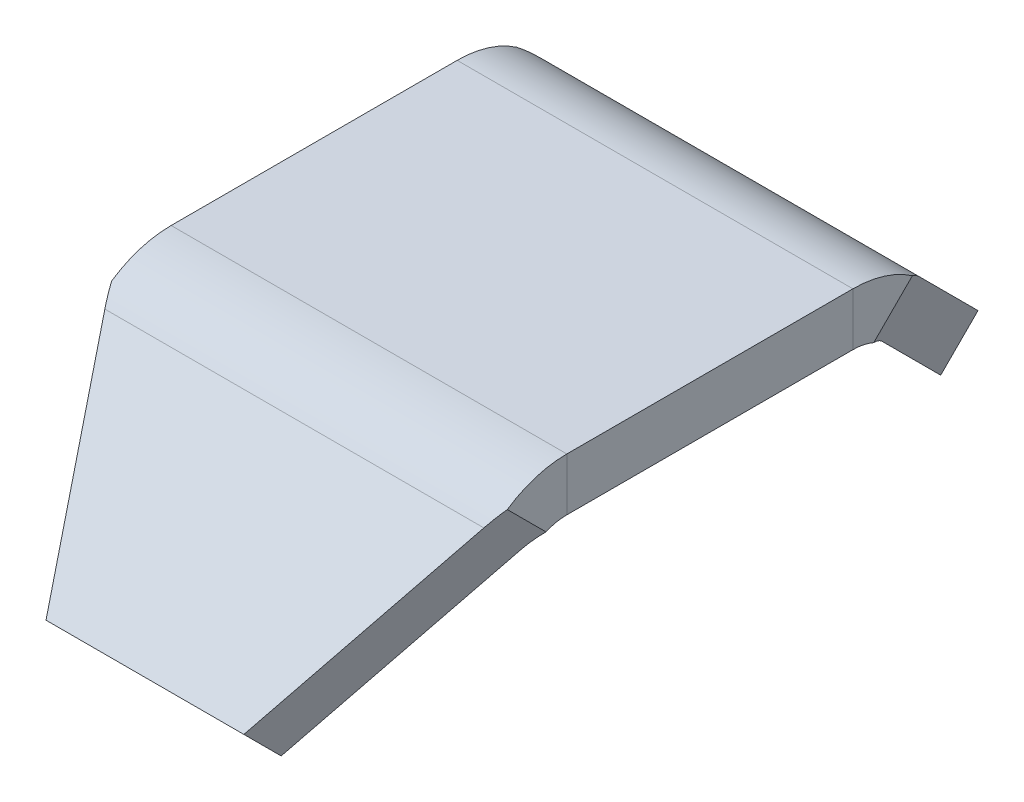
ISO-10303-21;
HEADER;
FILE_DESCRIPTION(('STEP AP214'),'2;1');
FILE_NAME('part.step','',(''),(''),'','','');
FILE_SCHEMA(('AUTOMOTIVE_DESIGN { 1 0 10303 214 1 1 1 1 }'));
ENDSEC;
DATA;
#1=APPLICATION_CONTEXT('core data for automotive mechanical design processes');
#2=APPLICATION_PROTOCOL_DEFINITION('international standard','automotive_design',2000,#1);
#3=PRODUCT_CONTEXT('',#1,'mechanical');
#4=PRODUCT('Part','Part','',(#3));
#5=PRODUCT_RELATED_PRODUCT_CATEGORY('part','',(#4));
#6=PRODUCT_DEFINITION_FORMATION('','',#4);
#7=PRODUCT_DEFINITION_CONTEXT('part definition',#1,'design');
#8=PRODUCT_DEFINITION('design','',#6,#7);
#9=PRODUCT_DEFINITION_SHAPE('','',#8);
#10=(LENGTH_UNIT() NAMED_UNIT(*) SI_UNIT(.MILLI.,.METRE.));
#11=(NAMED_UNIT(*) PLANE_ANGLE_UNIT() SI_UNIT($,.RADIAN.));
#12=(NAMED_UNIT(*) SI_UNIT($,.STERADIAN.) SOLID_ANGLE_UNIT());
#13=UNCERTAINTY_MEASURE_WITH_UNIT(LENGTH_MEASURE(1.E-05),#10,'distance_accuracy_value','');
#14=(GEOMETRIC_REPRESENTATION_CONTEXT(3) GLOBAL_UNCERTAINTY_ASSIGNED_CONTEXT((#13)) GLOBAL_UNIT_ASSIGNED_CONTEXT((#10,
#11,#12)) REPRESENTATION_CONTEXT('',''));
#15=CARTESIAN_POINT('',(0.,0.,0.));
#16=DIRECTION('',(0.,0.,1.));
#17=DIRECTION('',(1.,0.,0.));
#18=AXIS2_PLACEMENT_3D('',#15,#16,#17);
#19=CARTESIAN_POINT('',(60.,-2.34314575050759,27.3431457505076));
#20=DIRECTION('',(1.,0.,0.));
#21=DIRECTION('',(0.,0.,-1.));
#22=AXIS2_PLACEMENT_3D('',#19,#20,#21);
#23=PLANE('',#22);
#24=CARTESIAN_POINT('',(60.,-8.,21.6862915010153));
#25=DIRECTION('',(1.,0.,0.));
#26=DIRECTION('',(0.,0.,-1.));
#27=AXIS2_PLACEMENT_3D('',#24,#25,#26);
#28=CIRCLE('',#27,16.);
#29=CARTESIAN_POINT('',(60.,5.21051723159048,30.7130425485324));
#30=VERTEX_POINT('',#29);
#31=CARTESIAN_POINT('',(60.,8.,21.6862915010153));
#32=VERTEX_POINT('',#31);
#33=EDGE_CURVE('E191',#30,#32,#28,.F.);
#34=ORIENTED_EDGE('',*,*,#33,.F.);
#35=DIRECTION('',(0.,-0.707106781186551,-0.707106781186544));
#36=VECTOR('',#35,1.);
#37=CARTESIAN_POINT('',(60.,-0.251262658470964,25.251262658471));
#38=LINE('',#37,#36);
#39=CARTESIAN_POINT('',(60.,-0.652260638120036,24.8502646788219));
#40=VERTEX_POINT('',#39);
#41=EDGE_CURVE('E251',#30,#40,#38,.T.);
#42=ORIENTED_EDGE('',*,*,#41,.T.);
#43=CARTESIAN_POINT('',(60.,-8.,21.6862915010153));
#44=DIRECTION('',(1.,0.,0.));
#45=DIRECTION('',(0.,0.,-1.));
#46=AXIS2_PLACEMENT_3D('',#43,#44,#45);
#47=CIRCLE('',#46,8.);
#48=CARTESIAN_POINT('',(60.,0.,21.6862915010153));
#49=VERTEX_POINT('',#48);
#50=EDGE_CURVE('E193',#40,#49,#47,.F.);
#51=ORIENTED_EDGE('',*,*,#50,.T.);
#52=DIRECTION('',(0.,-1.,0.));
#53=VECTOR('',#52,1.);
#54=CARTESIAN_POINT('',(60.,8.,21.6862915010153));
#55=LINE('',#54,#53);
#56=EDGE_CURVE('E242',#32,#49,#55,.T.);
#57=ORIENTED_EDGE('',*,*,#56,.F.);
#58=EDGE_LOOP('',(#34,#42,#51,#57));
#59=FACE_BOUND('',#58,.T.);
#60=ADVANCED_FACE('F38',(#59),#23,.T.);
#61=CARTESIAN_POINT('',(0.,0.,21.6862915010153));
#62=DIRECTION('',(-1.,0.,0.));
#63=DIRECTION('',(0.,0.,1.));
#64=AXIS2_PLACEMENT_3D('',#61,#62,#63);
#65=PLANE('',#64);
#66=CARTESIAN_POINT('',(0.,-8.,21.6862915010153));
#67=DIRECTION('',(1.,0.,0.));
#68=DIRECTION('',(0.,0.,-1.));
#69=AXIS2_PLACEMENT_3D('',#66,#67,#68);
#70=CIRCLE('',#69,8.);
#71=CARTESIAN_POINT('',(0.,-0.652260638120032,24.8502646788219));
#72=VERTEX_POINT('',#71);
#73=CARTESIAN_POINT('',(0.,0.,21.6862915010153));
#74=VERTEX_POINT('',#73);
#75=EDGE_CURVE('E206',#72,#74,#70,.F.);
#76=ORIENTED_EDGE('',*,*,#75,.F.);
#77=DIRECTION('',(0.,0.707106781186551,0.707106781186544));
#78=VECTOR('',#77,1.);
#79=CARTESIAN_POINT('',(0.,-1.90811690796332,23.5944084089786));
#80=LINE('',#79,#78);
#81=CARTESIAN_POINT('',(0.,5.21051723159049,30.7130425485323));
#82=VERTEX_POINT('',#81);
#83=EDGE_CURVE('E269',#72,#82,#80,.T.);
#84=ORIENTED_EDGE('',*,*,#83,.T.);
#85=CARTESIAN_POINT('',(0.,-8.,21.6862915010153));
#86=DIRECTION('',(1.,0.,0.));
#87=DIRECTION('',(0.,0.,-1.));
#88=AXIS2_PLACEMENT_3D('',#85,#86,#87);
#89=CIRCLE('',#88,16.);
#90=CARTESIAN_POINT('',(0.,8.,21.6862915010153));
#91=VERTEX_POINT('',#90);
#92=EDGE_CURVE('E204',#82,#91,#89,.F.);
#93=ORIENTED_EDGE('',*,*,#92,.T.);
#94=DIRECTION('',(0.,1.,0.));
#95=VECTOR('',#94,1.);
#96=CARTESIAN_POINT('',(0.,0.,21.6862915010153));
#97=LINE('',#96,#95);
#98=EDGE_CURVE('E164',#74,#91,#97,.T.);
#99=ORIENTED_EDGE('',*,*,#98,.F.);
#100=EDGE_LOOP('',(#76,#84,#93,#99));
#101=FACE_BOUND('',#100,.T.);
#102=ADVANCED_FACE('F325',(#101),#65,.T.);
#103=CARTESIAN_POINT('',(0.,3.31370849898482,33.));
#104=DIRECTION('',(-1.,0.,0.));
#105=DIRECTION('',(0.,0.,1.));
#106=AXIS2_PLACEMENT_3D('',#103,#104,#105);
#107=PLANE('',#106);
#108=DIRECTION('',(0.,0.,-1.));
#109=VECTOR('',#108,1.);
#110=CARTESIAN_POINT('',(0.,0.,25.));
#111=LINE('',#110,#109);
#112=CARTESIAN_POINT('',(0.,0.,-21.6862915010153));
#113=VERTEX_POINT('',#112);
#114=EDGE_CURVE('E208',#74,#113,#111,.T.);
#115=ORIENTED_EDGE('',*,*,#114,.F.);
#116=ORIENTED_EDGE('',*,*,#98,.T.);
#117=DIRECTION('',(0.,0.,-1.));
#118=VECTOR('',#117,1.);
#119=CARTESIAN_POINT('',(0.,8.,25.));
#120=LINE('',#119,#118);
#121=CARTESIAN_POINT('',(0.,8.,-21.6862915010153));
#122=VERTEX_POINT('',#121);
#123=EDGE_CURVE('E202',#91,#122,#120,.T.);
#124=ORIENTED_EDGE('',*,*,#123,.T.);
#125=DIRECTION('',(0.,-1.,0.));
#126=VECTOR('',#125,1.);
#127=CARTESIAN_POINT('',(0.,8.,-21.6862915010153));
#128=LINE('',#127,#126);
#129=EDGE_CURVE('E165',#122,#113,#128,.T.);
#130=ORIENTED_EDGE('',*,*,#129,.T.);
#131=EDGE_LOOP('',(#115,#116,#124,#130));
#132=FACE_BOUND('',#131,.T.);
#133=ADVANCED_FACE('F304',(#132),#107,.T.);
#134=CARTESIAN_POINT('',(60.,0.,-21.6862915010153));
#135=DIRECTION('',(1.,0.,0.));
#136=DIRECTION('',(0.,0.,-1.));
#137=AXIS2_PLACEMENT_3D('',#134,#135,#136);
#138=PLANE('',#137);
#139=CARTESIAN_POINT('',(60.,-8.,-21.6862915010153));
#140=DIRECTION('',(1.,0.,0.));
#141=DIRECTION('',(0.,0.,-1.));
#142=AXIS2_PLACEMENT_3D('',#139,#140,#141);
#143=CIRCLE('',#142,8.);
#144=CARTESIAN_POINT('',(60.,0.,-21.6862915010153));
#145=VERTEX_POINT('',#144);
#146=CARTESIAN_POINT('',(60.,-0.652260638120024,-24.8502646788219));
#147=VERTEX_POINT('',#146);
#148=EDGE_CURVE('E198',#145,#147,#143,.F.);
#149=ORIENTED_EDGE('',*,*,#148,.T.);
#150=DIRECTION('',(0.,0.707106781186552,-0.707106781186543));
#151=VECTOR('',#150,1.);
#152=CARTESIAN_POINT('',(60.,-1.90811690796331,-23.5944084089786));
#153=LINE('',#152,#151);
#154=CARTESIAN_POINT('',(60.,5.2105172315905,-30.7130425485323));
#155=VERTEX_POINT('',#154);
#156=EDGE_CURVE('E185',#147,#155,#153,.T.);
#157=ORIENTED_EDGE('',*,*,#156,.T.);
#158=CARTESIAN_POINT('',(60.,-8.,-21.6862915010153));
#159=DIRECTION('',(1.,0.,0.));
#160=DIRECTION('',(0.,0.,-1.));
#161=AXIS2_PLACEMENT_3D('',#158,#159,#160);
#162=CIRCLE('',#161,16.);
#163=CARTESIAN_POINT('',(60.,8.,-21.6862915010153));
#164=VERTEX_POINT('',#163);
#165=EDGE_CURVE('E173',#164,#155,#162,.F.);
#166=ORIENTED_EDGE('',*,*,#165,.F.);
#167=DIRECTION('',(0.,1.,0.));
#168=VECTOR('',#167,1.);
#169=CARTESIAN_POINT('',(60.,0.,-21.6862915010153));
#170=LINE('',#169,#168);
#171=EDGE_CURVE('E152',#145,#164,#170,.T.);
#172=ORIENTED_EDGE('',*,*,#171,.F.);
#173=EDGE_LOOP('',(#149,#157,#166,#172));
#174=FACE_BOUND('',#173,.T.);
#175=ADVANCED_FACE('F183',(#174),#138,.T.);
#176=CARTESIAN_POINT('',(60.,3.31370849898482,-33.));
#177=DIRECTION('',(1.,0.,0.));
#178=DIRECTION('',(0.,0.,-1.));
#179=AXIS2_PLACEMENT_3D('',#176,#177,#178);
#180=PLANE('',#179);
#181=DIRECTION('',(0.,0.,-1.));
#182=VECTOR('',#181,1.);
#183=CARTESIAN_POINT('',(60.,0.,25.));
#184=LINE('',#183,#182);
#185=EDGE_CURVE('E159',#49,#145,#184,.T.);
#186=ORIENTED_EDGE('',*,*,#185,.T.);
#187=ORIENTED_EDGE('',*,*,#171,.T.);
#188=DIRECTION('',(0.,0.,-1.));
#189=VECTOR('',#188,1.);
#190=CARTESIAN_POINT('',(60.,8.,25.));
#191=LINE('',#190,#189);
#192=EDGE_CURVE('E157',#32,#164,#191,.T.);
#193=ORIENTED_EDGE('',*,*,#192,.F.);
#194=ORIENTED_EDGE('',*,*,#56,.T.);
#195=EDGE_LOOP('',(#186,#187,#193,#194));
#196=FACE_BOUND('',#195,.T.);
#197=ADVANCED_FACE('F154',(#196),#180,.T.);
#198=CARTESIAN_POINT('',(0.,-2.34314575050759,-27.3431457505076));
#199=DIRECTION('',(-1.,0.,0.));
#200=DIRECTION('',(0.,0.,1.));
#201=AXIS2_PLACEMENT_3D('',#198,#199,#200);
#202=PLANE('',#201);
#203=CARTESIAN_POINT('',(0.,-8.,-21.6862915010153));
#204=DIRECTION('',(1.,0.,0.));
#205=DIRECTION('',(0.,0.,-1.));
#206=AXIS2_PLACEMENT_3D('',#203,#204,#205);
#207=CIRCLE('',#206,16.);
#208=CARTESIAN_POINT('',(0.,5.2105172315905,-30.7130425485323));
#209=VERTEX_POINT('',#208);
#210=EDGE_CURVE('E176',#122,#209,#207,.F.);
#211=ORIENTED_EDGE('',*,*,#210,.T.);
#212=DIRECTION('',(0.,-0.707106781186552,0.707106781186543));
#213=VECTOR('',#212,1.);
#214=CARTESIAN_POINT('',(0.,-0.251262658470952,-25.251262658471));
#215=LINE('',#214,#213);
#216=CARTESIAN_POINT('',(0.,-0.652260638120024,-24.8502646788219));
#217=VERTEX_POINT('',#216);
#218=EDGE_CURVE('E282',#209,#217,#215,.T.);
#219=ORIENTED_EDGE('',*,*,#218,.T.);
#220=CARTESIAN_POINT('',(0.,-8.,-21.6862915010153));
#221=DIRECTION('',(1.,0.,0.));
#222=DIRECTION('',(0.,0.,-1.));
#223=AXIS2_PLACEMENT_3D('',#220,#221,#222);
#224=CIRCLE('',#223,8.);
#225=EDGE_CURVE('E186',#113,#217,#224,.F.);
#226=ORIENTED_EDGE('',*,*,#225,.F.);
#227=ORIENTED_EDGE('',*,*,#129,.F.);
#228=EDGE_LOOP('',(#211,#219,#226,#227));
#229=FACE_BOUND('',#228,.T.);
#230=ADVANCED_FACE('F300',(#229),#202,.T.);
#231=CARTESIAN_POINT('',(60.,0.,-25.));
#232=DIRECTION('',(0.,0.707106781186551,-0.707106781186544));
#233=DIRECTION('',(0.,0.707106781186544,0.707106781186551));
#234=AXIS2_PLACEMENT_3D('',#231,#232,#233);
#235=PLANE('',#234);
#236=DIRECTION('',(-1.,0.,0.));
#237=VECTOR('',#236,1.);
#238=CARTESIAN_POINT('',(60.,-2.34314575050759,-27.3431457505076));
#239=LINE('',#238,#237);
#240=CARTESIAN_POINT('',(58.7321273830041,-2.34314575050759,-27.3431457505076));
#241=VERTEX_POINT('',#240);
#242=CARTESIAN_POINT('',(1.26787261699594,-2.34314575050759,-27.3431457505076));
#243=VERTEX_POINT('',#242);
#244=EDGE_CURVE('E200',#241,#243,#239,.T.);
#245=ORIENTED_EDGE('',*,*,#244,.T.);
#246=DIRECTION('',(-0.393919298579168,0.649933683619678,0.649933683619685));
#247=VECTOR('',#246,1.);
#248=CARTESIAN_POINT('',(0.,-0.25126265847095,-25.251262658471));
#249=LINE('',#248,#247);
#250=CARTESIAN_POINT('',(15.,-25.,-50.0000000000003));
#251=VERTEX_POINT('',#250);
#252=EDGE_CURVE('E287',#243,#251,#249,.F.);
#253=ORIENTED_EDGE('',*,*,#252,.T.);
#254=DIRECTION('',(-1.,0.,0.));
#255=VECTOR('',#254,1.);
#256=CARTESIAN_POINT('',(60.,-25.,-50.0000000000003));
#257=LINE('',#256,#255);
#258=CARTESIAN_POINT('',(45.,-25.,-50.0000000000003));
#259=VERTEX_POINT('',#258);
#260=EDGE_CURVE('E237',#259,#251,#257,.T.);
#261=ORIENTED_EDGE('',*,*,#260,.F.);
#262=DIRECTION('',(-0.393919298579168,-0.649933683619678,-0.649933683619685));
#263=VECTOR('',#262,1.);
#264=CARTESIAN_POINT('',(45.,-25.,-50.0000000000003));
#265=LINE('',#264,#263);
#266=EDGE_CURVE('E260',#259,#241,#265,.F.);
#267=ORIENTED_EDGE('',*,*,#266,.T.);
#268=EDGE_LOOP('',(#245,#253,#261,#267));
#269=FACE_BOUND('',#268,.T.);
#270=ADVANCED_FACE('F292',(#269),#235,.F.);
#271=CARTESIAN_POINT('',(60.,-19.3431457505076,-55.6568542494926));
#272=DIRECTION('',(0.,-0.707106781186543,-0.707106781186552));
#273=DIRECTION('',(0.,0.707106781186552,-0.707106781186543));
#274=AXIS2_PLACEMENT_3D('',#271,#272,#273);
#275=PLANE('',#274);
#276=ORIENTED_EDGE('',*,*,#260,.T.);
#277=DIRECTION('',(0.,0.707106781186552,-0.707106781186543));
#278=VECTOR('',#277,1.);
#279=CARTESIAN_POINT('',(15.,-19.3431457505076,-55.6568542494926));
#280=LINE('',#279,#278);
#281=CARTESIAN_POINT('',(15.,-19.3431457505076,-55.6568542494926));
#282=VERTEX_POINT('',#281);
#283=EDGE_CURVE('E60',#251,#282,#280,.T.);
#284=ORIENTED_EDGE('',*,*,#283,.T.);
#285=DIRECTION('',(-1.,0.,0.));
#286=VECTOR('',#285,1.);
#287=CARTESIAN_POINT('',(60.,-19.3431457505076,-55.6568542494926));
#288=LINE('',#287,#286);
#289=CARTESIAN_POINT('',(45.,-19.3431457505076,-55.6568542494926));
#290=VERTEX_POINT('',#289);
#291=EDGE_CURVE('E235',#290,#282,#288,.T.);
#292=ORIENTED_EDGE('',*,*,#291,.F.);
#293=DIRECTION('',(0.,-0.707106781186552,0.707106781186543));
#294=VECTOR('',#293,1.);
#295=CARTESIAN_POINT('',(45.,-19.3431457505076,-55.6568542494926));
#296=LINE('',#295,#294);
#297=EDGE_CURVE('E257',#290,#259,#296,.T.);
#298=ORIENTED_EDGE('',*,*,#297,.T.);
#299=EDGE_LOOP('',(#276,#284,#292,#298));
#300=FACE_BOUND('',#299,.T.);
#301=ADVANCED_FACE('F295',(#300),#275,.T.);
#302=CARTESIAN_POINT('',(60.,5.65685424949242,-30.6568542494924));
#303=DIRECTION('',(0.,0.707106781186551,-0.707106781186544));
#304=DIRECTION('',(0.,0.707106781186544,0.707106781186551));
#305=AXIS2_PLACEMENT_3D('',#302,#303,#304);
#306=PLANE('',#305);
#307=ORIENTED_EDGE('',*,*,#291,.T.);
#308=DIRECTION('',(0.393919298579168,-0.649933683619678,-0.649933683619685));
#309=VECTOR('',#308,1.);
#310=CARTESIAN_POINT('',(9.18168758196761,-9.74342003018488,-46.0571285291698));
#311=LINE('',#310,#309);
#312=CARTESIAN_POINT('',(1.26787261699594,3.31370849898482,-33.));
#313=VERTEX_POINT('',#312);
#314=EDGE_CURVE('E46',#282,#313,#311,.F.);
#315=ORIENTED_EDGE('',*,*,#314,.T.);
#316=DIRECTION('',(-1.,0.,0.));
#317=VECTOR('',#316,1.);
#318=CARTESIAN_POINT('',(60.,3.31370849898482,-33.));
#319=LINE('',#318,#317);
#320=CARTESIAN_POINT('',(58.7321273830041,3.31370849898482,-33.));
#321=VERTEX_POINT('',#320);
#322=EDGE_CURVE('E180',#321,#313,#319,.T.);
#323=ORIENTED_EDGE('',*,*,#322,.F.);
#324=DIRECTION('',(0.393919298579168,0.649933683619678,0.649933683619685));
#325=VECTOR('',#324,1.);
#326=CARTESIAN_POINT('',(60.1286572456186,5.61786521628141,-30.6958432827034));
#327=LINE('',#326,#325);
#328=EDGE_CURVE('E267',#321,#290,#327,.F.);
#329=ORIENTED_EDGE('',*,*,#328,.T.);
#330=EDGE_LOOP('',(#307,#315,#323,#329));
#331=FACE_BOUND('',#330,.T.);
#332=ADVANCED_FACE('F315',(#331),#306,.T.);
#333=CARTESIAN_POINT('',(60.,-8.,-21.6862915010153));
#334=DIRECTION('',(-1.,0.,0.));
#335=DIRECTION('',(0.,0.,1.));
#336=AXIS2_PLACEMENT_3D('',#333,#334,#335);
#337=CYLINDRICAL_SURFACE('',#336,16.);
#338=ORIENTED_EDGE('',*,*,#322,.T.);
#339=CARTESIAN_POINT('',(1.26787261699594,-8.,-21.6862915010153));
#340=DIRECTION('',(0.919145030018058,0.278543007265576,0.278543007265579));
#341=DIRECTION('',(-0.393919298579167,0.649933683619678,0.649933683619686));
#342=AXIS2_PLACEMENT_3D('',#339,#340,#341);
#343=ELLIPSE('',#342,17.4074813848318,16.);
#344=EDGE_CURVE('E11',#313,#209,#343,.T.);
#345=ORIENTED_EDGE('',*,*,#344,.T.);
#346=ORIENTED_EDGE('',*,*,#210,.F.);
#347=DIRECTION('',(-1.,0.,0.));
#348=VECTOR('',#347,1.);
#349=CARTESIAN_POINT('',(60.,8.,-21.6862915010153));
#350=LINE('',#349,#348);
#351=EDGE_CURVE('E171',#164,#122,#350,.T.);
#352=ORIENTED_EDGE('',*,*,#351,.F.);
#353=ORIENTED_EDGE('',*,*,#165,.T.);
#354=CARTESIAN_POINT('',(58.7321273830041,-8.,-21.6862915010153));
#355=DIRECTION('',(-0.919145030018058,0.278543007265576,0.278543007265579));
#356=DIRECTION('',(-0.393919298579167,-0.649933683619678,-0.649933683619686));
#357=AXIS2_PLACEMENT_3D('',#354,#355,#356);
#358=ELLIPSE('',#357,17.4074813848318,16.);
#359=EDGE_CURVE('E265',#155,#321,#358,.T.);
#360=ORIENTED_EDGE('',*,*,#359,.T.);
#361=EDGE_LOOP('',(#338,#345,#346,#352,#353,#360));
#362=FACE_BOUND('',#361,.T.);
#363=ADVANCED_FACE('F172',(#362),#337,.T.);
#364=CARTESIAN_POINT('',(60.,8.,25.));
#365=DIRECTION('',(0.,1.,0.));
#366=DIRECTION('',(0.,0.,1.));
#367=AXIS2_PLACEMENT_3D('',#364,#365,#366);
#368=PLANE('',#367);
#369=ORIENTED_EDGE('',*,*,#123,.F.);
#370=DIRECTION('',(-1.,0.,0.));
#371=VECTOR('',#370,1.);
#372=CARTESIAN_POINT('',(60.,8.,21.6862915010153));
#373=LINE('',#372,#371);
#374=EDGE_CURVE('E181',#32,#91,#373,.T.);
#375=ORIENTED_EDGE('',*,*,#374,.F.);
#376=ORIENTED_EDGE('',*,*,#192,.T.);
#377=ORIENTED_EDGE('',*,*,#351,.T.);
#378=EDGE_LOOP('',(#369,#375,#376,#377));
#379=FACE_BOUND('',#378,.T.);
#380=ADVANCED_FACE('F189',(#379),#368,.T.);
#381=CARTESIAN_POINT('',(60.,-8.,21.6862915010153));
#382=DIRECTION('',(-1.,0.,0.));
#383=DIRECTION('',(0.,0.,1.));
#384=AXIS2_PLACEMENT_3D('',#381,#382,#383);
#385=CYLINDRICAL_SURFACE('',#384,16.);
#386=ORIENTED_EDGE('',*,*,#92,.F.);
#387=CARTESIAN_POINT('',(1.26787261699594,-8.,21.6862915010153));
#388=DIRECTION('',(0.919145030018058,0.278543007265576,-0.278543007265579));
#389=DIRECTION('',(-0.393919298579168,0.649933683619678,-0.649933683619685));
#390=AXIS2_PLACEMENT_3D('',#387,#388,#389);
#391=ELLIPSE('',#390,17.4074813848318,16.);
#392=CARTESIAN_POINT('',(1.26787261699594,3.31370849898482,33.));
#393=VERTEX_POINT('',#392);
#394=EDGE_CURVE('E272',#82,#393,#391,.T.);
#395=ORIENTED_EDGE('',*,*,#394,.T.);
#396=DIRECTION('',(-1.,0.,0.));
#397=VECTOR('',#396,1.);
#398=CARTESIAN_POINT('',(60.,3.31370849898482,33.));
#399=LINE('',#398,#397);
#400=CARTESIAN_POINT('',(58.7321273830041,3.31370849898482,33.));
#401=VERTEX_POINT('',#400);
#402=EDGE_CURVE('E230',#401,#393,#399,.T.);
#403=ORIENTED_EDGE('',*,*,#402,.F.);
#404=CARTESIAN_POINT('',(58.7321273830041,-8.,21.6862915010153));
#405=DIRECTION('',(-0.919145030018058,0.278543007265576,-0.278543007265579));
#406=DIRECTION('',(-0.393919298579168,-0.649933683619678,0.649933683619685));
#407=AXIS2_PLACEMENT_3D('',#404,#405,#406);
#408=ELLIPSE('',#407,17.4074813848318,16.);
#409=EDGE_CURVE('E249',#401,#30,#408,.T.);
#410=ORIENTED_EDGE('',*,*,#409,.T.);
#411=ORIENTED_EDGE('',*,*,#33,.T.);
#412=ORIENTED_EDGE('',*,*,#374,.T.);
#413=EDGE_LOOP('',(#386,#395,#403,#410,#411,#412));
#414=FACE_BOUND('',#413,.T.);
#415=ADVANCED_FACE('F374',(#414),#385,.T.);
#416=CARTESIAN_POINT('',(60.,5.65685424949241,30.6568542494924));
#417=DIRECTION('',(0.,0.707106781186551,0.707106781186544));
#418=DIRECTION('',(0.,-0.707106781186544,0.707106781186551));
#419=AXIS2_PLACEMENT_3D('',#416,#417,#418);
#420=PLANE('',#419);
#421=ORIENTED_EDGE('',*,*,#402,.T.);
#422=DIRECTION('',(-0.393919298579168,0.649933683619678,-0.649933683619685));
#423=VECTOR('',#422,1.);
#424=CARTESIAN_POINT('',(9.18168758196761,-9.74342003018489,46.0571285291698));
#425=LINE('',#424,#423);
#426=CARTESIAN_POINT('',(15.,-19.3431457505076,55.6568542494926));
#427=VERTEX_POINT('',#426);
#428=EDGE_CURVE('E274',#393,#427,#425,.F.);
#429=ORIENTED_EDGE('',*,*,#428,.T.);
#430=DIRECTION('',(-1.,0.,0.));
#431=VECTOR('',#430,1.);
#432=CARTESIAN_POINT('',(60.,-19.3431457505076,55.6568542494926));
#433=LINE('',#432,#431);
#434=CARTESIAN_POINT('',(45.,-19.3431457505076,55.6568542494926));
#435=VERTEX_POINT('',#434);
#436=EDGE_CURVE('E227',#435,#427,#433,.T.);
#437=ORIENTED_EDGE('',*,*,#436,.F.);
#438=DIRECTION('',(-0.393919298579168,-0.649933683619678,0.649933683619685));
#439=VECTOR('',#438,1.);
#440=CARTESIAN_POINT('',(60.1286572456186,5.6178652162814,30.6958432827034));
#441=LINE('',#440,#439);
#442=EDGE_CURVE('E247',#435,#401,#441,.F.);
#443=ORIENTED_EDGE('',*,*,#442,.T.);
#444=EDGE_LOOP('',(#421,#429,#437,#443));
#445=FACE_BOUND('',#444,.T.);
#446=ADVANCED_FACE('F369',(#445),#420,.T.);
#447=CARTESIAN_POINT('',(60.,-25.,50.0000000000003));
#448=DIRECTION('',(0.,-0.707106781186544,0.707106781186551));
#449=DIRECTION('',(0.,-0.707106781186551,-0.707106781186544));
#450=AXIS2_PLACEMENT_3D('',#447,#448,#449);
#451=PLANE('',#450);
#452=ORIENTED_EDGE('',*,*,#436,.T.);
#453=DIRECTION('',(0.,-0.707106781186551,-0.707106781186544));
#454=VECTOR('',#453,1.);
#455=CARTESIAN_POINT('',(15.,-25.,50.0000000000003));
#456=LINE('',#455,#454);
#457=CARTESIAN_POINT('',(15.,-25.,50.0000000000003));
#458=VERTEX_POINT('',#457);
#459=EDGE_CURVE('E276',#427,#458,#456,.T.);
#460=ORIENTED_EDGE('',*,*,#459,.T.);
#461=DIRECTION('',(-1.,0.,0.));
#462=VECTOR('',#461,1.);
#463=CARTESIAN_POINT('',(60.,-25.,50.0000000000003));
#464=LINE('',#463,#462);
#465=CARTESIAN_POINT('',(45.,-25.,50.0000000000003));
#466=VERTEX_POINT('',#465);
#467=EDGE_CURVE('E224',#466,#458,#464,.T.);
#468=ORIENTED_EDGE('',*,*,#467,.F.);
#469=DIRECTION('',(0.,0.707106781186551,0.707106781186544));
#470=VECTOR('',#469,1.);
#471=CARTESIAN_POINT('',(45.,-25.,50.0000000000003));
#472=LINE('',#471,#470);
#473=EDGE_CURVE('E244',#466,#435,#472,.T.);
#474=ORIENTED_EDGE('',*,*,#473,.T.);
#475=EDGE_LOOP('',(#452,#460,#468,#474));
#476=FACE_BOUND('',#475,.T.);
#477=ADVANCED_FACE('F366',(#476),#451,.T.);
#478=CARTESIAN_POINT('',(60.,0.,25.));
#479=DIRECTION('',(0.,0.707106781186551,0.707106781186544));
#480=DIRECTION('',(0.,-0.707106781186544,0.707106781186551));
#481=AXIS2_PLACEMENT_3D('',#478,#479,#480);
#482=PLANE('',#481);
#483=ORIENTED_EDGE('',*,*,#467,.T.);
#484=DIRECTION('',(0.393919298579168,-0.649933683619678,0.649933683619685));
#485=VECTOR('',#484,1.);
#486=CARTESIAN_POINT('',(0.,-0.251262658470955,25.251262658471));
#487=LINE('',#486,#485);
#488=CARTESIAN_POINT('',(1.26787261699594,-2.34314575050759,27.3431457505076));
#489=VERTEX_POINT('',#488);
#490=EDGE_CURVE('E278',#458,#489,#487,.F.);
#491=ORIENTED_EDGE('',*,*,#490,.T.);
#492=DIRECTION('',(-1.,0.,0.));
#493=VECTOR('',#492,1.);
#494=CARTESIAN_POINT('',(60.,-2.34314575050759,27.3431457505076));
#495=LINE('',#494,#493);
#496=CARTESIAN_POINT('',(58.7321273830041,-2.34314575050759,27.3431457505076));
#497=VERTEX_POINT('',#496);
#498=EDGE_CURVE('E221',#497,#489,#495,.T.);
#499=ORIENTED_EDGE('',*,*,#498,.F.);
#500=DIRECTION('',(0.393919298579168,0.649933683619678,-0.649933683619685));
#501=VECTOR('',#500,1.);
#502=CARTESIAN_POINT('',(45.,-25.,50.0000000000003));
#503=LINE('',#502,#501);
#504=EDGE_CURVE('E255',#497,#466,#503,.F.);
#505=ORIENTED_EDGE('',*,*,#504,.T.);
#506=EDGE_LOOP('',(#483,#491,#499,#505));
#507=FACE_BOUND('',#506,.T.);
#508=ADVANCED_FACE('F354',(#507),#482,.F.);
#509=CARTESIAN_POINT('',(60.,-8.,21.6862915010153));
#510=DIRECTION('',(-1.,0.,0.));
#511=DIRECTION('',(0.,0.,1.));
#512=AXIS2_PLACEMENT_3D('',#509,#510,#511);
#513=CYLINDRICAL_SURFACE('',#512,8.);
#514=ORIENTED_EDGE('',*,*,#498,.T.);
#515=CARTESIAN_POINT('',(1.26787261699594,-8.,21.6862915010153));
#516=DIRECTION('',(0.919145030018058,0.278543007265576,-0.278543007265579));
#517=DIRECTION('',(-0.393919298579168,0.649933683619678,-0.649933683619685));
#518=AXIS2_PLACEMENT_3D('',#515,#516,#517);
#519=ELLIPSE('',#518,8.7037406924159,8.);
#520=EDGE_CURVE('E280',#489,#72,#519,.F.);
#521=ORIENTED_EDGE('',*,*,#520,.T.);
#522=ORIENTED_EDGE('',*,*,#75,.T.);
#523=DIRECTION('',(-1.,0.,0.));
#524=VECTOR('',#523,1.);
#525=CARTESIAN_POINT('',(60.,0.,21.6862915010153));
#526=LINE('',#525,#524);
#527=EDGE_CURVE('E218',#49,#74,#526,.T.);
#528=ORIENTED_EDGE('',*,*,#527,.F.);
#529=ORIENTED_EDGE('',*,*,#50,.F.);
#530=CARTESIAN_POINT('',(58.7321273830041,-8.,21.6862915010153));
#531=DIRECTION('',(-0.919145030018058,0.278543007265576,-0.278543007265579));
#532=DIRECTION('',(-0.393919298579168,-0.649933683619678,0.649933683619685));
#533=AXIS2_PLACEMENT_3D('',#530,#531,#532);
#534=ELLIPSE('',#533,8.7037406924159,8.);
#535=EDGE_CURVE('E253',#40,#497,#534,.F.);
#536=ORIENTED_EDGE('',*,*,#535,.T.);
#537=EDGE_LOOP('',(#514,#521,#522,#528,#529,#536));
#538=FACE_BOUND('',#537,.T.);
#539=ADVANCED_FACE('F358',(#538),#513,.F.);
#540=CARTESIAN_POINT('',(60.,0.,25.));
#541=DIRECTION('',(0.,1.,0.));
#542=DIRECTION('',(0.,0.,1.));
#543=AXIS2_PLACEMENT_3D('',#540,#541,#542);
#544=PLANE('',#543);
#545=ORIENTED_EDGE('',*,*,#114,.T.);
#546=DIRECTION('',(-1.,0.,0.));
#547=VECTOR('',#546,1.);
#548=CARTESIAN_POINT('',(60.,0.,-21.6862915010153));
#549=LINE('',#548,#547);
#550=EDGE_CURVE('E215',#145,#113,#549,.T.);
#551=ORIENTED_EDGE('',*,*,#550,.F.);
#552=ORIENTED_EDGE('',*,*,#185,.F.);
#553=ORIENTED_EDGE('',*,*,#527,.T.);
#554=EDGE_LOOP('',(#545,#551,#552,#553));
#555=FACE_BOUND('',#554,.T.);
#556=ADVANCED_FACE('F306',(#555),#544,.F.);
#557=CARTESIAN_POINT('',(60.,-8.,-21.6862915010153));
#558=DIRECTION('',(-1.,0.,0.));
#559=DIRECTION('',(0.,0.,1.));
#560=AXIS2_PLACEMENT_3D('',#557,#558,#559);
#561=CYLINDRICAL_SURFACE('',#560,8.);
#562=ORIENTED_EDGE('',*,*,#225,.T.);
#563=CARTESIAN_POINT('',(1.26787261699594,-8.,-21.6862915010153));
#564=DIRECTION('',(0.919145030018058,0.278543007265576,0.278543007265579));
#565=DIRECTION('',(-0.393919298579167,0.649933683619678,0.649933683619686));
#566=AXIS2_PLACEMENT_3D('',#563,#564,#565);
#567=ELLIPSE('',#566,8.7037406924159,8.);
#568=EDGE_CURVE('E285',#217,#243,#567,.F.);
#569=ORIENTED_EDGE('',*,*,#568,.T.);
#570=ORIENTED_EDGE('',*,*,#244,.F.);
#571=CARTESIAN_POINT('',(58.7321273830041,-8.,-21.6862915010153));
#572=DIRECTION('',(-0.919145030018058,0.278543007265576,0.278543007265579));
#573=DIRECTION('',(-0.393919298579167,-0.649933683619678,-0.649933683619686));
#574=AXIS2_PLACEMENT_3D('',#571,#572,#573);
#575=ELLIPSE('',#574,8.7037406924159,8.);
#576=EDGE_CURVE('E262',#241,#147,#575,.F.);
#577=ORIENTED_EDGE('',*,*,#576,.T.);
#578=ORIENTED_EDGE('',*,*,#148,.F.);
#579=ORIENTED_EDGE('',*,*,#550,.T.);
#580=EDGE_LOOP('',(#562,#569,#570,#577,#578,#579));
#581=FACE_BOUND('',#580,.T.);
#582=ADVANCED_FACE('F310',(#581),#561,.F.);
#583=CARTESIAN_POINT('',(45.,-25.,50.0000000000003));
#584=DIRECTION('',(-0.919145030018058,0.278543007265576,-0.278543007265579));
#585=DIRECTION('',(0.,0.707106781186551,0.707106781186544));
#586=AXIS2_PLACEMENT_3D('',#583,#584,#585);
#587=PLANE('',#586);
#588=ORIENTED_EDGE('',*,*,#535,.F.);
#589=ORIENTED_EDGE('',*,*,#41,.F.);
#590=ORIENTED_EDGE('',*,*,#409,.F.);
#591=ORIENTED_EDGE('',*,*,#442,.F.);
#592=ORIENTED_EDGE('',*,*,#473,.F.);
#593=ORIENTED_EDGE('',*,*,#504,.F.);
#594=EDGE_LOOP('',(#588,#589,#590,#591,#592,#593));
#595=FACE_BOUND('',#594,.T.);
#596=ADVANCED_FACE('F336',(#595),#587,.F.);
#597=CARTESIAN_POINT('',(45.,-19.3431457505076,-55.6568542494926));
#598=DIRECTION('',(-0.919145030018058,0.278543007265576,0.278543007265579));
#599=DIRECTION('',(0.,-0.707106781186552,0.707106781186543));
#600=AXIS2_PLACEMENT_3D('',#597,#598,#599);
#601=PLANE('',#600);
#602=ORIENTED_EDGE('',*,*,#359,.F.);
#603=ORIENTED_EDGE('',*,*,#156,.F.);
#604=ORIENTED_EDGE('',*,*,#576,.F.);
#605=ORIENTED_EDGE('',*,*,#266,.F.);
#606=ORIENTED_EDGE('',*,*,#297,.F.);
#607=ORIENTED_EDGE('',*,*,#328,.F.);
#608=EDGE_LOOP('',(#602,#603,#604,#605,#606,#607));
#609=FACE_BOUND('',#608,.T.);
#610=ADVANCED_FACE('F313',(#609),#601,.F.);
#611=CARTESIAN_POINT('',(0.,-1.90811690796333,23.5944084089786));
#612=DIRECTION('',(0.919145030018058,0.278543007265576,-0.278543007265579));
#613=DIRECTION('',(0.,0.707106781186551,0.707106781186544));
#614=AXIS2_PLACEMENT_3D('',#611,#612,#613);
#615=PLANE('',#614);
#616=ORIENTED_EDGE('',*,*,#490,.F.);
#617=ORIENTED_EDGE('',*,*,#459,.F.);
#618=ORIENTED_EDGE('',*,*,#428,.F.);
#619=ORIENTED_EDGE('',*,*,#394,.F.);
#620=ORIENTED_EDGE('',*,*,#83,.F.);
#621=ORIENTED_EDGE('',*,*,#520,.F.);
#622=EDGE_LOOP('',(#616,#617,#618,#619,#620,#621));
#623=FACE_BOUND('',#622,.T.);
#624=ADVANCED_FACE('F341',(#623),#615,.F.);
#625=CARTESIAN_POINT('',(0.,-0.251262658470951,-25.251262658471));
#626=DIRECTION('',(0.919145030018058,0.278543007265576,0.278543007265579));
#627=DIRECTION('',(0.,-0.707106781186552,0.707106781186543));
#628=AXIS2_PLACEMENT_3D('',#625,#626,#627);
#629=PLANE('',#628);
#630=ORIENTED_EDGE('',*,*,#314,.F.);
#631=ORIENTED_EDGE('',*,*,#283,.F.);
#632=ORIENTED_EDGE('',*,*,#252,.F.);
#633=ORIENTED_EDGE('',*,*,#568,.F.);
#634=ORIENTED_EDGE('',*,*,#218,.F.);
#635=ORIENTED_EDGE('',*,*,#344,.F.);
#636=EDGE_LOOP('',(#630,#631,#632,#633,#634,#635));
#637=FACE_BOUND('',#636,.T.);
#638=ADVANCED_FACE('F40',(#637),#629,.F.);
#639=CLOSED_SHELL('',(#60,#102,#133,#175,#197,#230,#270,#301,#332,#363,#380,#415,#446,#477,#508,
#539,#556,#582,#596,#610,#624,#638));
#640=MANIFOLD_SOLID_BREP('B2',#639);
#641=ADVANCED_BREP_SHAPE_REPRESENTATION('',(#18,#640),#14);
#642=SHAPE_DEFINITION_REPRESENTATION(#9,#641);
ENDSEC;
END-ISO-10303-21;
